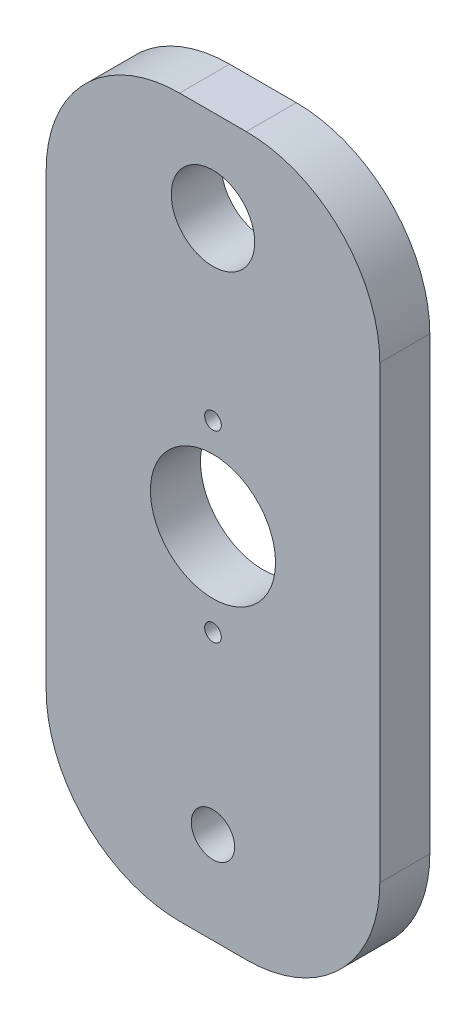
ISO-10303-21;
HEADER;
FILE_DESCRIPTION(('STEP AP214'),'2;1');
FILE_NAME('part.step','',(''),(''),'','','');
FILE_SCHEMA(('AUTOMOTIVE_DESIGN { 1 0 10303 214 1 1 1 1 }'));
ENDSEC;
DATA;
#1=APPLICATION_CONTEXT('core data for automotive mechanical design processes');
#2=APPLICATION_PROTOCOL_DEFINITION('international standard','automotive_design',2000,#1);
#3=PRODUCT_CONTEXT('',#1,'mechanical');
#4=PRODUCT('Part','Part','',(#3));
#5=PRODUCT_RELATED_PRODUCT_CATEGORY('part','',(#4));
#6=PRODUCT_DEFINITION_FORMATION('','',#4);
#7=PRODUCT_DEFINITION_CONTEXT('part definition',#1,'design');
#8=PRODUCT_DEFINITION('design','',#6,#7);
#9=PRODUCT_DEFINITION_SHAPE('','',#8);
#10=(LENGTH_UNIT() NAMED_UNIT(*) SI_UNIT(.MILLI.,.METRE.));
#11=(NAMED_UNIT(*) PLANE_ANGLE_UNIT() SI_UNIT($,.RADIAN.));
#12=(NAMED_UNIT(*) SI_UNIT($,.STERADIAN.) SOLID_ANGLE_UNIT());
#13=UNCERTAINTY_MEASURE_WITH_UNIT(LENGTH_MEASURE(1.E-05),#10,'distance_accuracy_value','');
#14=(GEOMETRIC_REPRESENTATION_CONTEXT(3) GLOBAL_UNCERTAINTY_ASSIGNED_CONTEXT((#13)) GLOBAL_UNIT_ASSIGNED_CONTEXT((#10,
#11,#12)) REPRESENTATION_CONTEXT('',''));
#15=CARTESIAN_POINT('',(0.,0.,0.));
#16=DIRECTION('',(0.,0.,1.));
#17=DIRECTION('',(1.,0.,0.));
#18=AXIS2_PLACEMENT_3D('',#15,#16,#17);
#19=CARTESIAN_POINT('',(20.,135.,30.));
#20=DIRECTION('',(0.,0.,-1.));
#21=DIRECTION('',(-1.,0.,0.));
#22=AXIS2_PLACEMENT_3D('',#19,#20,#21);
#23=PLANE('',#22);
#24=CARTESIAN_POINT('',(20.,135.,30.));
#25=DIRECTION('',(0.,0.,1.));
#26=DIRECTION('',(-1.,0.,0.));
#27=AXIS2_PLACEMENT_3D('',#24,#25,#26);
#28=CIRCLE('',#27,80.);
#29=CARTESIAN_POINT('',(100.,135.,30.));
#30=VERTEX_POINT('',#29);
#31=CARTESIAN_POINT('',(20.,215.,30.));
#32=VERTEX_POINT('',#31);
#33=EDGE_CURVE('E145',#30,#32,#28,.T.);
#34=ORIENTED_EDGE('',*,*,#33,.T.);
#35=DIRECTION('',(-1.,0.,0.));
#36=VECTOR('',#35,1.);
#37=CARTESIAN_POINT('',(20.,215.,30.));
#38=LINE('',#37,#36);
#39=CARTESIAN_POINT('',(-20.,215.,30.));
#40=VERTEX_POINT('',#39);
#41=EDGE_CURVE('E93',#32,#40,#38,.T.);
#42=ORIENTED_EDGE('',*,*,#41,.T.);
#43=CARTESIAN_POINT('',(-20.,135.,30.));
#44=DIRECTION('',(0.,0.,1.));
#45=DIRECTION('',(1.,0.,0.));
#46=AXIS2_PLACEMENT_3D('',#43,#44,#45);
#47=CIRCLE('',#46,80.);
#48=CARTESIAN_POINT('',(-100.,135.,30.));
#49=VERTEX_POINT('',#48);
#50=EDGE_CURVE('E160',#40,#49,#47,.T.);
#51=ORIENTED_EDGE('',*,*,#50,.T.);
#52=DIRECTION('',(0.,-1.,0.));
#53=VECTOR('',#52,1.);
#54=CARTESIAN_POINT('',(-100.,135.,30.));
#55=LINE('',#54,#53);
#56=CARTESIAN_POINT('',(-100.,-135.,30.));
#57=VERTEX_POINT('',#56);
#58=EDGE_CURVE('E173',#49,#57,#55,.T.);
#59=ORIENTED_EDGE('',*,*,#58,.T.);
#60=CARTESIAN_POINT('',(-20.,-135.,30.));
#61=DIRECTION('',(0.,0.,1.));
#62=DIRECTION('',(-1.,0.,0.));
#63=AXIS2_PLACEMENT_3D('',#60,#61,#62);
#64=CIRCLE('',#63,80.);
#65=CARTESIAN_POINT('',(-20.,-215.,30.));
#66=VERTEX_POINT('',#65);
#67=EDGE_CURVE('E112',#57,#66,#64,.T.);
#68=ORIENTED_EDGE('',*,*,#67,.T.);
#69=DIRECTION('',(1.,0.,0.));
#70=VECTOR('',#69,1.);
#71=CARTESIAN_POINT('',(20.,-215.,30.));
#72=LINE('',#71,#70);
#73=CARTESIAN_POINT('',(20.,-215.,30.));
#74=VERTEX_POINT('',#73);
#75=EDGE_CURVE('E106',#66,#74,#72,.T.);
#76=ORIENTED_EDGE('',*,*,#75,.T.);
#77=CARTESIAN_POINT('',(20.,-135.,30.));
#78=DIRECTION('',(0.,0.,1.));
#79=DIRECTION('',(-1.,0.,0.));
#80=AXIS2_PLACEMENT_3D('',#77,#78,#79);
#81=CIRCLE('',#80,80.);
#82=CARTESIAN_POINT('',(100.,-135.,30.));
#83=VERTEX_POINT('',#82);
#84=EDGE_CURVE('E110',#74,#83,#81,.T.);
#85=ORIENTED_EDGE('',*,*,#84,.T.);
#86=DIRECTION('',(0.,1.,0.));
#87=VECTOR('',#86,1.);
#88=CARTESIAN_POINT('',(100.,135.,30.));
#89=LINE('',#88,#87);
#90=EDGE_CURVE('E50',#83,#30,#89,.T.);
#91=ORIENTED_EDGE('',*,*,#90,.T.);
#92=EDGE_LOOP('',(#34,#42,#51,#59,#68,#76,#85,#91));
#93=FACE_BOUND('',#92,.T.);
#94=CARTESIAN_POINT('',(0.,0.,30.));
#95=DIRECTION('',(0.,0.,1.));
#96=DIRECTION('',(1.,0.,0.));
#97=AXIS2_PLACEMENT_3D('',#94,#95,#96);
#98=CIRCLE('',#97,37.5);
#99=CARTESIAN_POINT('',(37.5,0.,30.));
#100=VERTEX_POINT('',#99);
#101=EDGE_CURVE('E134',#100,#100,#98,.T.);
#102=ORIENTED_EDGE('',*,*,#101,.F.);
#103=EDGE_LOOP('',(#102));
#104=FACE_BOUND('',#103,.T.);
#105=CARTESIAN_POINT('',(0.,-160.,30.));
#106=DIRECTION('',(0.,0.,1.));
#107=DIRECTION('',(1.,0.,0.));
#108=AXIS2_PLACEMENT_3D('',#105,#106,#107);
#109=CIRCLE('',#108,13.);
#110=CARTESIAN_POINT('',(13.,-160.,30.));
#111=VERTEX_POINT('',#110);
#112=EDGE_CURVE('E182',#111,#111,#109,.T.);
#113=ORIENTED_EDGE('',*,*,#112,.F.);
#114=EDGE_LOOP('',(#113));
#115=FACE_BOUND('',#114,.T.);
#116=CARTESIAN_POINT('',(0.,160.,30.));
#117=DIRECTION('',(0.,0.,1.));
#118=DIRECTION('',(1.,0.,0.));
#119=AXIS2_PLACEMENT_3D('',#116,#117,#118);
#120=CIRCLE('',#119,25.);
#121=CARTESIAN_POINT('',(25.,160.,30.));
#122=VERTEX_POINT('',#121);
#123=EDGE_CURVE('E188',#122,#122,#120,.T.);
#124=ORIENTED_EDGE('',*,*,#123,.F.);
#125=EDGE_LOOP('',(#124));
#126=FACE_BOUND('',#125,.T.);
#127=CARTESIAN_POINT('',(0.,55.,30.));
#128=DIRECTION('',(0.,0.,1.));
#129=DIRECTION('',(1.,0.,0.));
#130=AXIS2_PLACEMENT_3D('',#127,#128,#129);
#131=CIRCLE('',#130,5.);
#132=CARTESIAN_POINT('',(5.00000000000001,55.,30.));
#133=VERTEX_POINT('',#132);
#134=EDGE_CURVE('E194',#133,#133,#131,.T.);
#135=ORIENTED_EDGE('',*,*,#134,.F.);
#136=EDGE_LOOP('',(#135));
#137=FACE_BOUND('',#136,.T.);
#138=CARTESIAN_POINT('',(0.,-55.,30.));
#139=DIRECTION('',(0.,0.,1.));
#140=DIRECTION('',(1.,0.,0.));
#141=AXIS2_PLACEMENT_3D('',#138,#139,#140);
#142=CIRCLE('',#141,5.);
#143=CARTESIAN_POINT('',(5.00000000000003,-55.,30.));
#144=VERTEX_POINT('',#143);
#145=EDGE_CURVE('E200',#144,#144,#142,.T.);
#146=ORIENTED_EDGE('',*,*,#145,.F.);
#147=EDGE_LOOP('',(#146));
#148=FACE_BOUND('',#147,.T.);
#149=ADVANCED_FACE('F33',(#93,#104,#115,#126,#137,#148),#23,.F.);
#150=CARTESIAN_POINT('',(20.,135.,0.));
#151=DIRECTION('',(0.,0.,-1.));
#152=DIRECTION('',(-1.,0.,0.));
#153=AXIS2_PLACEMENT_3D('',#150,#151,#152);
#154=PLANE('',#153);
#155=CARTESIAN_POINT('',(0.,55.,0.));
#156=DIRECTION('',(0.,0.,1.));
#157=DIRECTION('',(1.,0.,0.));
#158=AXIS2_PLACEMENT_3D('',#155,#156,#157);
#159=CIRCLE('',#158,5.);
#160=CARTESIAN_POINT('',(5.00000000000001,55.,0.));
#161=VERTEX_POINT('',#160);
#162=EDGE_CURVE('E197',#161,#161,#159,.T.);
#163=ORIENTED_EDGE('',*,*,#162,.T.);
#164=EDGE_LOOP('',(#163));
#165=FACE_BOUND('',#164,.T.);
#166=CARTESIAN_POINT('',(0.,-160.,0.));
#167=DIRECTION('',(0.,0.,1.));
#168=DIRECTION('',(1.,0.,0.));
#169=AXIS2_PLACEMENT_3D('',#166,#167,#168);
#170=CIRCLE('',#169,13.);
#171=CARTESIAN_POINT('',(13.,-160.,0.));
#172=VERTEX_POINT('',#171);
#173=EDGE_CURVE('E185',#172,#172,#170,.T.);
#174=ORIENTED_EDGE('',*,*,#173,.T.);
#175=EDGE_LOOP('',(#174));
#176=FACE_BOUND('',#175,.T.);
#177=CARTESIAN_POINT('',(20.,135.,0.));
#178=DIRECTION('',(0.,0.,1.));
#179=DIRECTION('',(-1.,0.,0.));
#180=AXIS2_PLACEMENT_3D('',#177,#178,#179);
#181=CIRCLE('',#180,80.);
#182=CARTESIAN_POINT('',(100.,135.,0.));
#183=VERTEX_POINT('',#182);
#184=CARTESIAN_POINT('',(20.,215.,0.));
#185=VERTEX_POINT('',#184);
#186=EDGE_CURVE('E130',#183,#185,#181,.T.);
#187=ORIENTED_EDGE('',*,*,#186,.F.);
#188=DIRECTION('',(0.,1.,0.));
#189=VECTOR('',#188,1.);
#190=CARTESIAN_POINT('',(100.,135.,0.));
#191=LINE('',#190,#189);
#192=CARTESIAN_POINT('',(100.,-135.,0.));
#193=VERTEX_POINT('',#192);
#194=EDGE_CURVE('E85',#193,#183,#191,.T.);
#195=ORIENTED_EDGE('',*,*,#194,.F.);
#196=CARTESIAN_POINT('',(20.,-135.,0.));
#197=DIRECTION('',(0.,0.,1.));
#198=DIRECTION('',(-1.,0.,0.));
#199=AXIS2_PLACEMENT_3D('',#196,#197,#198);
#200=CIRCLE('',#199,80.);
#201=CARTESIAN_POINT('',(20.,-215.,0.));
#202=VERTEX_POINT('',#201);
#203=EDGE_CURVE('E79',#202,#193,#200,.T.);
#204=ORIENTED_EDGE('',*,*,#203,.F.);
#205=DIRECTION('',(1.,0.,0.));
#206=VECTOR('',#205,1.);
#207=CARTESIAN_POINT('',(20.,-215.,0.));
#208=LINE('',#207,#206);
#209=CARTESIAN_POINT('',(-20.,-215.,0.));
#210=VERTEX_POINT('',#209);
#211=EDGE_CURVE('E120',#210,#202,#208,.T.);
#212=ORIENTED_EDGE('',*,*,#211,.F.);
#213=CARTESIAN_POINT('',(-20.,-135.,0.));
#214=DIRECTION('',(0.,0.,1.));
#215=DIRECTION('',(-1.,0.,0.));
#216=AXIS2_PLACEMENT_3D('',#213,#214,#215);
#217=CIRCLE('',#216,80.);
#218=CARTESIAN_POINT('',(-100.,-135.,0.));
#219=VERTEX_POINT('',#218);
#220=EDGE_CURVE('E140',#219,#210,#217,.T.);
#221=ORIENTED_EDGE('',*,*,#220,.F.);
#222=DIRECTION('',(0.,-1.,0.));
#223=VECTOR('',#222,1.);
#224=CARTESIAN_POINT('',(-100.,135.,0.));
#225=LINE('',#224,#223);
#226=CARTESIAN_POINT('',(-100.,135.,0.));
#227=VERTEX_POINT('',#226);
#228=EDGE_CURVE('E138',#227,#219,#225,.T.);
#229=ORIENTED_EDGE('',*,*,#228,.F.);
#230=CARTESIAN_POINT('',(-20.,135.,0.));
#231=DIRECTION('',(0.,0.,1.));
#232=DIRECTION('',(1.,0.,0.));
#233=AXIS2_PLACEMENT_3D('',#230,#231,#232);
#234=CIRCLE('',#233,80.);
#235=CARTESIAN_POINT('',(-20.,215.,0.));
#236=VERTEX_POINT('',#235);
#237=EDGE_CURVE('E136',#236,#227,#234,.T.);
#238=ORIENTED_EDGE('',*,*,#237,.F.);
#239=DIRECTION('',(-1.,0.,0.));
#240=VECTOR('',#239,1.);
#241=CARTESIAN_POINT('',(20.,215.,0.));
#242=LINE('',#241,#240);
#243=EDGE_CURVE('E133',#185,#236,#242,.T.);
#244=ORIENTED_EDGE('',*,*,#243,.F.);
#245=EDGE_LOOP('',(#187,#195,#204,#212,#221,#229,#238,#244));
#246=FACE_BOUND('',#245,.T.);
#247=CARTESIAN_POINT('',(0.,0.,0.));
#248=DIRECTION('',(0.,0.,1.));
#249=DIRECTION('',(1.,0.,0.));
#250=AXIS2_PLACEMENT_3D('',#247,#248,#249);
#251=CIRCLE('',#250,37.5);
#252=CARTESIAN_POINT('',(37.5,0.,0.));
#253=VERTEX_POINT('',#252);
#254=EDGE_CURVE('E179',#253,#253,#251,.T.);
#255=ORIENTED_EDGE('',*,*,#254,.T.);
#256=EDGE_LOOP('',(#255));
#257=FACE_BOUND('',#256,.T.);
#258=CARTESIAN_POINT('',(0.,160.,0.));
#259=DIRECTION('',(0.,0.,1.));
#260=DIRECTION('',(1.,0.,0.));
#261=AXIS2_PLACEMENT_3D('',#258,#259,#260);
#262=CIRCLE('',#261,25.);
#263=CARTESIAN_POINT('',(25.,160.,0.));
#264=VERTEX_POINT('',#263);
#265=EDGE_CURVE('E191',#264,#264,#262,.T.);
#266=ORIENTED_EDGE('',*,*,#265,.T.);
#267=EDGE_LOOP('',(#266));
#268=FACE_BOUND('',#267,.T.);
#269=CARTESIAN_POINT('',(0.,-55.,0.));
#270=DIRECTION('',(0.,0.,1.));
#271=DIRECTION('',(1.,0.,0.));
#272=AXIS2_PLACEMENT_3D('',#269,#270,#271);
#273=CIRCLE('',#272,5.);
#274=CARTESIAN_POINT('',(5.00000000000003,-55.,0.));
#275=VERTEX_POINT('',#274);
#276=EDGE_CURVE('E203',#275,#275,#273,.T.);
#277=ORIENTED_EDGE('',*,*,#276,.T.);
#278=EDGE_LOOP('',(#277));
#279=FACE_BOUND('',#278,.T.);
#280=ADVANCED_FACE('F164',(#165,#176,#246,#257,#268,#279),#154,.T.);
#281=CARTESIAN_POINT('',(20.,135.,30.));
#282=DIRECTION('',(0.,0.,-1.));
#283=DIRECTION('',(-1.,0.,0.));
#284=AXIS2_PLACEMENT_3D('',#281,#282,#283);
#285=CYLINDRICAL_SURFACE('',#284,80.);
#286=ORIENTED_EDGE('',*,*,#186,.T.);
#287=DIRECTION('',(0.,0.,-1.));
#288=VECTOR('',#287,1.);
#289=CARTESIAN_POINT('',(20.,215.,30.));
#290=LINE('',#289,#288);
#291=EDGE_CURVE('E11',#32,#185,#290,.T.);
#292=ORIENTED_EDGE('',*,*,#291,.F.);
#293=ORIENTED_EDGE('',*,*,#33,.F.);
#294=DIRECTION('',(0.,0.,-1.));
#295=VECTOR('',#294,1.);
#296=CARTESIAN_POINT('',(100.,135.,30.));
#297=LINE('',#296,#295);
#298=EDGE_CURVE('E126',#30,#183,#297,.T.);
#299=ORIENTED_EDGE('',*,*,#298,.T.);
#300=EDGE_LOOP('',(#286,#292,#293,#299));
#301=FACE_BOUND('',#300,.T.);
#302=ADVANCED_FACE('F35',(#301),#285,.T.);
#303=CARTESIAN_POINT('',(20.,215.,30.));
#304=DIRECTION('',(0.,-1.,0.));
#305=DIRECTION('',(0.,0.,-1.));
#306=AXIS2_PLACEMENT_3D('',#303,#304,#305);
#307=PLANE('',#306);
#308=ORIENTED_EDGE('',*,*,#243,.T.);
#309=DIRECTION('',(0.,0.,-1.));
#310=VECTOR('',#309,1.);
#311=CARTESIAN_POINT('',(-20.,215.,30.));
#312=LINE('',#311,#310);
#313=EDGE_CURVE('E42',#40,#236,#312,.T.);
#314=ORIENTED_EDGE('',*,*,#313,.F.);
#315=ORIENTED_EDGE('',*,*,#41,.F.);
#316=ORIENTED_EDGE('',*,*,#291,.T.);
#317=EDGE_LOOP('',(#308,#314,#315,#316));
#318=FACE_BOUND('',#317,.T.);
#319=ADVANCED_FACE('F235',(#318),#307,.F.);
#320=CARTESIAN_POINT('',(-20.,135.,30.));
#321=DIRECTION('',(0.,0.,-1.));
#322=DIRECTION('',(-1.,0.,0.));
#323=AXIS2_PLACEMENT_3D('',#320,#321,#322);
#324=CYLINDRICAL_SURFACE('',#323,80.);
#325=ORIENTED_EDGE('',*,*,#237,.T.);
#326=DIRECTION('',(0.,0.,-1.));
#327=VECTOR('',#326,1.);
#328=CARTESIAN_POINT('',(-100.,135.,30.));
#329=LINE('',#328,#327);
#330=EDGE_CURVE('E152',#49,#227,#329,.T.);
#331=ORIENTED_EDGE('',*,*,#330,.F.);
#332=ORIENTED_EDGE('',*,*,#50,.F.);
#333=ORIENTED_EDGE('',*,*,#313,.T.);
#334=EDGE_LOOP('',(#325,#331,#332,#333));
#335=FACE_BOUND('',#334,.T.);
#336=ADVANCED_FACE('F158',(#335),#324,.T.);
#337=CARTESIAN_POINT('',(-100.,135.,30.));
#338=DIRECTION('',(1.,0.,0.));
#339=DIRECTION('',(0.,1.,0.));
#340=AXIS2_PLACEMENT_3D('',#337,#338,#339);
#341=PLANE('',#340);
#342=ORIENTED_EDGE('',*,*,#228,.T.);
#343=DIRECTION('',(0.,0.,-1.));
#344=VECTOR('',#343,1.);
#345=CARTESIAN_POINT('',(-100.,-135.,30.));
#346=LINE('',#345,#344);
#347=EDGE_CURVE('E149',#57,#219,#346,.T.);
#348=ORIENTED_EDGE('',*,*,#347,.F.);
#349=ORIENTED_EDGE('',*,*,#58,.F.);
#350=ORIENTED_EDGE('',*,*,#330,.T.);
#351=EDGE_LOOP('',(#342,#348,#349,#350));
#352=FACE_BOUND('',#351,.T.);
#353=ADVANCED_FACE('F169',(#352),#341,.F.);
#354=CARTESIAN_POINT('',(-20.,-135.,30.));
#355=DIRECTION('',(0.,0.,-1.));
#356=DIRECTION('',(-1.,0.,0.));
#357=AXIS2_PLACEMENT_3D('',#354,#355,#356);
#358=CYLINDRICAL_SURFACE('',#357,80.);
#359=ORIENTED_EDGE('',*,*,#220,.T.);
#360=DIRECTION('',(0.,0.,-1.));
#361=VECTOR('',#360,1.);
#362=CARTESIAN_POINT('',(-20.,-215.,30.));
#363=LINE('',#362,#361);
#364=EDGE_CURVE('E121',#66,#210,#363,.T.);
#365=ORIENTED_EDGE('',*,*,#364,.F.);
#366=ORIENTED_EDGE('',*,*,#67,.F.);
#367=ORIENTED_EDGE('',*,*,#347,.T.);
#368=EDGE_LOOP('',(#359,#365,#366,#367));
#369=FACE_BOUND('',#368,.T.);
#370=ADVANCED_FACE('F172',(#369),#358,.T.);
#371=CARTESIAN_POINT('',(20.,-215.,30.));
#372=DIRECTION('',(0.,1.,0.));
#373=DIRECTION('',(-1.,0.,0.));
#374=AXIS2_PLACEMENT_3D('',#371,#372,#373);
#375=PLANE('',#374);
#376=ORIENTED_EDGE('',*,*,#211,.T.);
#377=DIRECTION('',(0.,0.,-1.));
#378=VECTOR('',#377,1.);
#379=CARTESIAN_POINT('',(20.,-215.,30.));
#380=LINE('',#379,#378);
#381=EDGE_CURVE('E117',#74,#202,#380,.T.);
#382=ORIENTED_EDGE('',*,*,#381,.F.);
#383=ORIENTED_EDGE('',*,*,#75,.F.);
#384=ORIENTED_EDGE('',*,*,#364,.T.);
#385=EDGE_LOOP('',(#376,#382,#383,#384));
#386=FACE_BOUND('',#385,.T.);
#387=ADVANCED_FACE('F118',(#386),#375,.F.);
#388=CARTESIAN_POINT('',(20.,-135.,30.));
#389=DIRECTION('',(0.,0.,-1.));
#390=DIRECTION('',(-1.,0.,0.));
#391=AXIS2_PLACEMENT_3D('',#388,#389,#390);
#392=CYLINDRICAL_SURFACE('',#391,80.);
#393=ORIENTED_EDGE('',*,*,#203,.T.);
#394=DIRECTION('',(0.,0.,-1.));
#395=VECTOR('',#394,1.);
#396=CARTESIAN_POINT('',(100.,-135.,30.));
#397=LINE('',#396,#395);
#398=EDGE_CURVE('E122',#83,#193,#397,.T.);
#399=ORIENTED_EDGE('',*,*,#398,.F.);
#400=ORIENTED_EDGE('',*,*,#84,.F.);
#401=ORIENTED_EDGE('',*,*,#381,.T.);
#402=EDGE_LOOP('',(#393,#399,#400,#401));
#403=FACE_BOUND('',#402,.T.);
#404=ADVANCED_FACE('F124',(#403),#392,.T.);
#405=CARTESIAN_POINT('',(100.,135.,30.));
#406=DIRECTION('',(-1.,0.,0.));
#407=DIRECTION('',(0.,-1.,0.));
#408=AXIS2_PLACEMENT_3D('',#405,#406,#407);
#409=PLANE('',#408);
#410=ORIENTED_EDGE('',*,*,#194,.T.);
#411=ORIENTED_EDGE('',*,*,#298,.F.);
#412=ORIENTED_EDGE('',*,*,#90,.F.);
#413=ORIENTED_EDGE('',*,*,#398,.T.);
#414=EDGE_LOOP('',(#410,#411,#412,#413));
#415=FACE_BOUND('',#414,.T.);
#416=ADVANCED_FACE('F223',(#415),#409,.F.);
#417=CARTESIAN_POINT('',(0.,0.,30.));
#418=DIRECTION('',(0.,0.,-1.));
#419=DIRECTION('',(-1.,0.,0.));
#420=AXIS2_PLACEMENT_3D('',#417,#418,#419);
#421=CYLINDRICAL_SURFACE('',#420,37.5);
#422=ORIENTED_EDGE('',*,*,#101,.T.);
#423=EDGE_LOOP('',(#422));
#424=FACE_BOUND('',#423,.T.);
#425=ORIENTED_EDGE('',*,*,#254,.F.);
#426=EDGE_LOOP('',(#425));
#427=FACE_BOUND('',#426,.T.);
#428=ADVANCED_FACE('F220',(#424,#427),#421,.F.);
#429=CARTESIAN_POINT('',(0.,-160.,30.));
#430=DIRECTION('',(0.,0.,-1.));
#431=DIRECTION('',(-1.,0.,0.));
#432=AXIS2_PLACEMENT_3D('',#429,#430,#431);
#433=CYLINDRICAL_SURFACE('',#432,13.);
#434=ORIENTED_EDGE('',*,*,#112,.T.);
#435=EDGE_LOOP('',(#434));
#436=FACE_BOUND('',#435,.T.);
#437=ORIENTED_EDGE('',*,*,#173,.F.);
#438=EDGE_LOOP('',(#437));
#439=FACE_BOUND('',#438,.T.);
#440=ADVANCED_FACE('F299',(#436,#439),#433,.F.);
#441=CARTESIAN_POINT('',(0.,160.,30.));
#442=DIRECTION('',(0.,0.,-1.));
#443=DIRECTION('',(-1.,0.,0.));
#444=AXIS2_PLACEMENT_3D('',#441,#442,#443);
#445=CYLINDRICAL_SURFACE('',#444,25.);
#446=ORIENTED_EDGE('',*,*,#123,.T.);
#447=EDGE_LOOP('',(#446));
#448=FACE_BOUND('',#447,.T.);
#449=ORIENTED_EDGE('',*,*,#265,.F.);
#450=EDGE_LOOP('',(#449));
#451=FACE_BOUND('',#450,.T.);
#452=ADVANCED_FACE('F307',(#448,#451),#445,.F.);
#453=CARTESIAN_POINT('',(0.,55.,30.));
#454=DIRECTION('',(0.,0.,-1.));
#455=DIRECTION('',(-1.,0.,0.));
#456=AXIS2_PLACEMENT_3D('',#453,#454,#455);
#457=CYLINDRICAL_SURFACE('',#456,5.);
#458=ORIENTED_EDGE('',*,*,#134,.T.);
#459=EDGE_LOOP('',(#458));
#460=FACE_BOUND('',#459,.T.);
#461=ORIENTED_EDGE('',*,*,#162,.F.);
#462=EDGE_LOOP('',(#461));
#463=FACE_BOUND('',#462,.T.);
#464=ADVANCED_FACE('F315',(#460,#463),#457,.F.);
#465=CARTESIAN_POINT('',(0.,-55.,30.));
#466=DIRECTION('',(0.,0.,-1.));
#467=DIRECTION('',(-1.,0.,0.));
#468=AXIS2_PLACEMENT_3D('',#465,#466,#467);
#469=CYLINDRICAL_SURFACE('',#468,5.);
#470=ORIENTED_EDGE('',*,*,#145,.T.);
#471=EDGE_LOOP('',(#470));
#472=FACE_BOUND('',#471,.T.);
#473=ORIENTED_EDGE('',*,*,#276,.F.);
#474=EDGE_LOOP('',(#473));
#475=FACE_BOUND('',#474,.T.);
#476=ADVANCED_FACE('F209',(#472,#475),#469,.F.);
#477=CLOSED_SHELL('',(#149,#280,#302,#319,#336,#353,#370,#387,#404,#416,#428,#440,#452,#464,#476));
#478=MANIFOLD_SOLID_BREP('B2',#477);
#479=ADVANCED_BREP_SHAPE_REPRESENTATION('',(#18,#478),#14);
#480=SHAPE_DEFINITION_REPRESENTATION(#9,#479);
ENDSEC;
END-ISO-10303-21;
